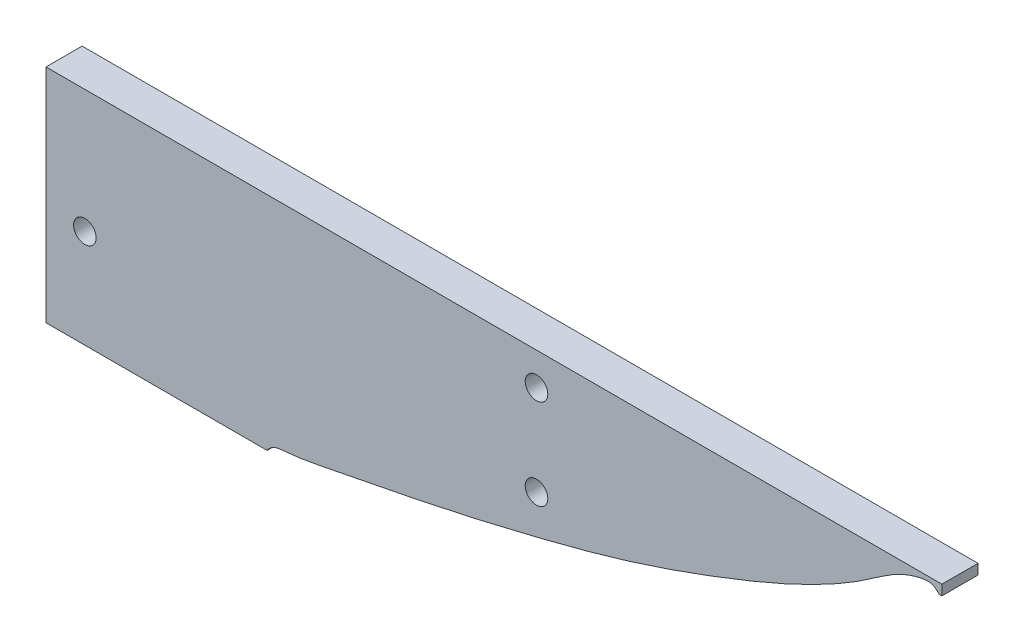
ISO-10303-21;
HEADER;
FILE_DESCRIPTION(('STEP AP214'),'2;1');
FILE_NAME('part.step','',(''),(''),'','','');
FILE_SCHEMA(('AUTOMOTIVE_DESIGN { 1 0 10303 214 1 1 1 1 }'));
ENDSEC;
DATA;
#1=APPLICATION_CONTEXT('core data for automotive mechanical design processes');
#2=APPLICATION_PROTOCOL_DEFINITION('international standard','automotive_design',2000,#1);
#3=PRODUCT_CONTEXT('',#1,'mechanical');
#4=PRODUCT('Part','Part','',(#3));
#5=PRODUCT_RELATED_PRODUCT_CATEGORY('part','',(#4));
#6=PRODUCT_DEFINITION_FORMATION('','',#4);
#7=PRODUCT_DEFINITION_CONTEXT('part definition',#1,'design');
#8=PRODUCT_DEFINITION('design','',#6,#7);
#9=PRODUCT_DEFINITION_SHAPE('','',#8);
#10=(LENGTH_UNIT() NAMED_UNIT(*) SI_UNIT(.MILLI.,.METRE.));
#11=(NAMED_UNIT(*) PLANE_ANGLE_UNIT() SI_UNIT($,.RADIAN.));
#12=(NAMED_UNIT(*) SI_UNIT($,.STERADIAN.) SOLID_ANGLE_UNIT());
#13=UNCERTAINTY_MEASURE_WITH_UNIT(LENGTH_MEASURE(1.E-05),#10,'distance_accuracy_value','');
#14=(GEOMETRIC_REPRESENTATION_CONTEXT(3) GLOBAL_UNCERTAINTY_ASSIGNED_CONTEXT((#13)) GLOBAL_UNIT_ASSIGNED_CONTEXT((#10,
#11,#12)) REPRESENTATION_CONTEXT('',''));
#15=CARTESIAN_POINT('',(0.,0.,0.));
#16=DIRECTION('',(0.,0.,1.));
#17=DIRECTION('',(1.,0.,0.));
#18=AXIS2_PLACEMENT_3D('',#15,#16,#17);
#19=CARTESIAN_POINT('',(17.2333887189385,-29.0220472319426,276.));
#20=DIRECTION('',(0.,0.,-1.));
#21=DIRECTION('',(-1.,0.,0.));
#22=AXIS2_PLACEMENT_3D('',#19,#20,#21);
#23=PLANE('',#22);
#24=CARTESIAN_POINT('',(0.0705666698621599,-25.,276.));
#25=DIRECTION('',(0.,0.,-1.));
#26=DIRECTION('',(-1.,0.,0.));
#27=AXIS2_PLACEMENT_3D('',#24,#25,#26);
#28=CIRCLE('',#27,2.5);
#29=CARTESIAN_POINT('',(-2.42943333013784,-25.,276.));
#30=VERTEX_POINT('',#29);
#31=EDGE_CURVE('E238',#30,#30,#28,.F.);
#32=ORIENTED_EDGE('',*,*,#31,.F.);
#33=EDGE_LOOP('',(#32));
#34=FACE_BOUND('',#33,.T.);
#35=CARTESIAN_POINT('',(89.2269503586397,1.49247205306208E-13,276.));
#36=CARTESIAN_POINT('',(89.1908642631752,0.0998298809493926,276.));
#37=CARTESIAN_POINT('',(89.12473322516,0.183706206110191,276.));
#38=CARTESIAN_POINT('',(88.9729048679818,0.329810453575534,276.));
#39=CARTESIAN_POINT('',(88.8904896104568,0.394857408906376,276.));
#40=CARTESIAN_POINT('',(88.644167156488,0.591135212475435,276.));
#41=CARTESIAN_POINT('',(88.4839696875495,0.727365268226304,276.));
#42=CARTESIAN_POINT('',(88.1379026837907,0.966441642701985,276.));
#43=CARTESIAN_POINT('',(87.956054395125,1.06793941582744,276.));
#44=CARTESIAN_POINT('',(87.658282860914,1.16902271226711,276.));
#45=CARTESIAN_POINT('',(87.555207302582,1.19535812571003,276.));
#46=CARTESIAN_POINT('',(87.3496293461408,1.23459941595705,276.));
#47=CARTESIAN_POINT('',(87.246249801161,1.24787231132341,276.));
#48=CARTESIAN_POINT('',(86.9348402087448,1.27403001856005,276.));
#49=CARTESIAN_POINT('',(86.7248702440939,1.27379048273107,276.));
#50=CARTESIAN_POINT('',(86.306423964309,1.25383675225267,276.));
#51=CARTESIAN_POINT('',(86.0990286290816,1.23505774639025,276.));
#52=CARTESIAN_POINT('',(85.4813808157867,1.15686620116418,276.));
#53=CARTESIAN_POINT('',(85.0758686909006,1.07462559045073,276.));
#54=CARTESIAN_POINT('',(83.8682590875084,0.784915195307387,276.));
#55=CARTESIAN_POINT('',(83.0711615958042,0.531094150862169,276.));
#56=CARTESIAN_POINT('',(81.5259256374172,-0.0576238139626139,276.));
#57=CARTESIAN_POINT('',(80.7765608345635,-0.394881318596581,276.));
#58=CARTESIAN_POINT('',(78.5965167383571,-1.53219615816202,276.));
#59=CARTESIAN_POINT('',(77.230754733304,-2.45201587282181,276.));
#60=CARTESIAN_POINT('',(75.1985385920178,-3.8620504783442,276.));
#61=CARTESIAN_POINT('',(74.5234682022098,-4.33617494178902,276.));
#62=CARTESIAN_POINT('',(73.1640950831805,-5.2684711868607,276.));
#63=CARTESIAN_POINT('',(72.4808892046777,-5.72857497254762,276.));
#64=CARTESIAN_POINT('',(70.4116337529203,-7.07515890200524,276.));
#65=CARTESIAN_POINT('',(69.0048975681431,-7.92611034015839,276.));
#66=CARTESIAN_POINT('',(66.1532783390216,-9.56249699877378,276.));
#67=CARTESIAN_POINT('',(64.708881598737,-10.3487674335368,276.));
#68=CARTESIAN_POINT('',(61.7933797544643,-11.875437398081,276.));
#69=CARTESIAN_POINT('',(60.3218826662428,-12.6151919015329,276.));
#70=CARTESIAN_POINT('',(57.3506439169798,-14.0460786107289,276.));
#71=CARTESIAN_POINT('',(55.8539001840211,-14.7366881290595,276.));
#72=CARTESIAN_POINT('',(51.337831470486,-16.7508374373275,276.));
#73=CARTESIAN_POINT('',(48.293308669808,-18.0196731609298,276.));
#74=CARTESIAN_POINT('',(42.1715920248814,-20.4657175408574,276.));
#75=CARTESIAN_POINT('',(39.0925038548523,-21.6413273019962,276.));
#76=CARTESIAN_POINT('',(32.9034762833672,-23.9123085332553,276.));
#77=CARTESIAN_POINT('',(29.7933959316709,-25.0086572761028,276.));
#78=CARTESIAN_POINT('',(23.5398431349112,-27.0984871184917,276.));
#79=CARTESIAN_POINT('',(20.3942529700696,-28.0888434338914,276.));
#80=CARTESIAN_POINT('',(14.0725244678072,-29.9552510299939,276.));
#81=CARTESIAN_POINT('',(10.8957614292863,-30.8321493890972,276.));
#82=CARTESIAN_POINT('',(4.52178111769644,-32.5135075856523,276.));
#83=CARTESIAN_POINT('',(1.32540922267386,-33.3212862958322,276.));
#84=CARTESIAN_POINT('',(-5.07614417074092,-34.8964917932046,276.));
#85=CARTESIAN_POINT('',(-8.2821060243183,-35.6624978049024,276.));
#86=CARTESIAN_POINT('',(-14.7061552609168,-37.1440056918165,276.));
#87=CARTESIAN_POINT('',(-17.9248976926897,-37.856829007306,276.));
#88=CARTESIAN_POINT('',(-24.3728549588553,-39.2319683362701,276.));
#89=CARTESIAN_POINT('',(-27.6019921231389,-39.8956389105145,276.));
#90=CARTESIAN_POINT('',(-34.0663458917021,-41.1922011265147,276.));
#91=CARTESIAN_POINT('',(-37.3005391050708,-41.8304024146382,276.));
#92=CARTESIAN_POINT('',(-42.1530043629878,-42.7816576800251,276.));
#93=CARTESIAN_POINT('',(-43.7705550169791,-43.0984582724244,276.));
#94=CARTESIAN_POINT('',(-46.1983652521204,-43.5659278854451,276.));
#95=CARTESIAN_POINT('',(-47.0078976626582,-43.720382588257,276.));
#96=CARTESIAN_POINT('',(-48.6273609163055,-44.0272135007652,276.));
#97=CARTESIAN_POINT('',(-49.4369227355959,-44.1817696551541,276.));
#98=CARTESIAN_POINT('',(-51.0584401473537,-44.476432935129,276.));
#99=CARTESIAN_POINT('',(-51.8708424327574,-44.6139088288052,276.));
#100=CARTESIAN_POINT('',(-53.0956767619379,-44.7827589887938,276.));
#101=CARTESIAN_POINT('',(-53.5049562500999,-44.8330512012459,276.));
#102=CARTESIAN_POINT('',(-54.325702170619,-44.9204211703346,276.));
#103=CARTESIAN_POINT('',(-54.7375224891055,-44.9553679185136,276.));
#104=CARTESIAN_POINT('',(-55.5621587457519,-45.0192504910567,276.));
#105=CARTESIAN_POINT('',(-55.9744736564472,-45.0512112033362,276.));
#106=CARTESIAN_POINT('',(-56.7930669092068,-45.1515776230256,276.));
#107=CARTESIAN_POINT('',(-57.2000247263942,-45.215881088075,276.));
#108=CARTESIAN_POINT('',(-57.7982740111188,-45.385916370147,276.));
#109=CARTESIAN_POINT('',(-57.995561765395,-45.455446388705,276.));
#110=CARTESIAN_POINT('',(-58.2860399847313,-45.5926656801053,276.));
#111=CARTESIAN_POINT('',(-58.3828971858376,-45.6445846347909,276.));
#112=CARTESIAN_POINT('',(-58.5682150358491,-45.7590157817693,276.));
#113=CARTESIAN_POINT('',(-58.6569406203326,-45.8212423557429,276.));
#114=CARTESIAN_POINT('',(-58.9154178364917,-46.0177311406933,276.));
#115=CARTESIAN_POINT('',(-59.0752702518724,-46.164604763616,276.));
#116=CARTESIAN_POINT('',(-59.3117627427097,-46.3891016675219,276.));
#117=CARTESIAN_POINT('',(-59.3894997364969,-46.4650349885878,276.));
#118=CARTESIAN_POINT('',(-59.5289937891365,-46.6317604617944,276.));
#119=CARTESIAN_POINT('',(-59.5889433789973,-46.7262640546928,276.));
#120=CARTESIAN_POINT('',(-59.6152711669954,-46.8312276483597,276.));
#121=B_SPLINE_CURVE_WITH_KNOTS('',3,(#35,#36,#37,#38,#39,#40,#41,#42,#43,#44,#45,#46,#47,#48,
#49,#50,#51,#52,#53,#54,#55,#56,#57,#58,#59,#60,#61,#62,#63,#64,#65,#66,#67,#68,#69,#70,#71,#72,
#73,#74,#75,#76,#77,#78,#79,#80,#81,#82,#83,#84,#85,#86,#87,#88,#89,#90,#91,#92,#93,#94,#95,#96,
#97,#98,#99,#100,#101,#102,#103,#104,#105,#106,#107,#108,#109,#110,#111,#112,#113,#114,#115,
#116,#117,#118,#119,#120),.UNSPECIFIED.,.F.,.F.,(4,2,2,2,2,2,2,2,2,2,2,2,2,2,2,2,2,2,2,2,2,2,2,
2,2,2,2,2,2,2,2,2,2,2,2,2,2,2,2,2,2,2,4),(0.,0.00195312500000033,0.00390625000000067,
0.00781250000000122,0.0117187500000017,0.0136718750000018,0.0156250000000019,0.0195312500000019,
0.0234375000000019,0.0312500000000019,0.0468750000000016,0.0625000000000012,0.0937500000000008,
0.109375000000001,0.125000000000001,0.156250000000001,0.187500000000001,0.218750000000001,
0.250000000000001,0.312500000000001,0.375000000000001,0.4375,0.5,0.5625,0.625,0.6875,0.75,
0.8125,0.875,0.90625,0.921875,0.9375,0.953125,0.9609375,0.96875,0.9765625,0.984375,0.98828125,
0.990234375,0.9921875,0.99609375,0.998046875,1.),.UNSPECIFIED.);
#122=CARTESIAN_POINT('',(-59.6152711669953,-46.8312276483596,276.));
#123=VERTEX_POINT('',#122);
#124=CARTESIAN_POINT('',(89.2269503586398,0.,276.));
#125=VERTEX_POINT('',#124);
#126=EDGE_CURVE('E196',#123,#125,#121,.F.);
#127=ORIENTED_EDGE('',*,*,#126,.T.);
#128=DIRECTION('',(1.,0.,0.));
#129=VECTOR('',#128,1.);
#130=CARTESIAN_POINT('',(89.2269503586398,0.,276.));
#131=LINE('',#130,#129);
#132=CARTESIAN_POINT('',(89.8916366130668,0.,276.));
#133=VERTEX_POINT('',#132);
#134=EDGE_CURVE('E90',#125,#133,#131,.T.);
#135=ORIENTED_EDGE('',*,*,#134,.T.);
#136=DIRECTION('',(0.,1.,0.));
#137=VECTOR('',#136,1.);
#138=CARTESIAN_POINT('',(89.8916366130668,2.25600000000004,276.));
#139=LINE('',#138,#137);
#140=CARTESIAN_POINT('',(89.8916366130668,2.25600000000004,276.));
#141=VERTEX_POINT('',#140);
#142=EDGE_CURVE('E103',#133,#141,#139,.T.);
#143=ORIENTED_EDGE('',*,*,#142,.T.);
#144=DIRECTION('',(-1.,0.,0.));
#145=VECTOR('',#144,1.);
#146=CARTESIAN_POINT('',(89.8916366130668,2.25600000000004,276.));
#147=LINE('',#146,#145);
#148=CARTESIAN_POINT('',(-108.607261007694,2.25600000000002,276.));
#149=VERTEX_POINT('',#148);
#150=EDGE_CURVE('E97',#141,#149,#147,.T.);
#151=ORIENTED_EDGE('',*,*,#150,.T.);
#152=DIRECTION('',(0.,-1.,0.));
#153=VECTOR('',#152,1.);
#154=CARTESIAN_POINT('',(-108.607261007694,-46.8398070824682,276.));
#155=LINE('',#154,#153);
#156=CARTESIAN_POINT('',(-108.607261007694,-46.8398070824682,276.));
#157=VERTEX_POINT('',#156);
#158=EDGE_CURVE('E101',#149,#157,#155,.T.);
#159=ORIENTED_EDGE('',*,*,#158,.T.);
#160=CARTESIAN_POINT('',(-59.6152711669953,-46.8312276483596,276.));
#161=CARTESIAN_POINT('',(-75.9459341047568,-46.8356281130031,276.));
#162=CARTESIAN_POINT('',(-92.276597535054,-46.8384307623825,276.));
#163=CARTESIAN_POINT('',(-108.607261007694,-46.8398070824681,276.));
#164=B_SPLINE_CURVE_WITH_KNOTS('',3,(#160,#161,#162,#163),.UNSPECIFIED.,.F.,.F.,(4,4),(0.,1.),.UNSPECIFIED.);
#165=EDGE_CURVE('E51',#157,#123,#164,.F.);
#166=ORIENTED_EDGE('',*,*,#165,.T.);
#167=EDGE_LOOP('',(#127,#135,#143,#151,#159,#166));
#168=FACE_BOUND('',#167,.T.);
#169=CARTESIAN_POINT('',(0.0705666698621599,-4.96037406111782,276.));
#170=DIRECTION('',(0.,0.,-1.));
#171=DIRECTION('',(-1.,0.,0.));
#172=AXIS2_PLACEMENT_3D('',#169,#170,#171);
#173=CIRCLE('',#172,2.5);
#174=CARTESIAN_POINT('',(-2.42943333013784,-4.96037406111782,276.));
#175=VERTEX_POINT('',#174);
#176=EDGE_CURVE('E237',#175,#175,#173,.F.);
#177=ORIENTED_EDGE('',*,*,#176,.F.);
#178=EDGE_LOOP('',(#177));
#179=FACE_BOUND('',#178,.T.);
#180=CARTESIAN_POINT('',(-100.,-25.,276.));
#181=DIRECTION('',(0.,0.,-1.));
#182=DIRECTION('',(-1.,0.,0.));
#183=AXIS2_PLACEMENT_3D('',#180,#181,#182);
#184=CIRCLE('',#183,2.5);
#185=CARTESIAN_POINT('',(-102.5,-25.,276.));
#186=VERTEX_POINT('',#185);
#187=EDGE_CURVE('E241',#186,#186,#184,.F.);
#188=ORIENTED_EDGE('',*,*,#187,.F.);
#189=EDGE_LOOP('',(#188));
#190=FACE_BOUND('',#189,.T.);
#191=ADVANCED_FACE('F30',(#34,#168,#179,#190),#23,.F.);
#192=CARTESIAN_POINT('',(17.2333887189385,-29.0220472319426,268.));
#193=DIRECTION('',(0.,0.,-1.));
#194=DIRECTION('',(-1.,0.,0.));
#195=AXIS2_PLACEMENT_3D('',#192,#193,#194);
#196=PLANE('',#195);
#197=CARTESIAN_POINT('',(0.0705666698621599,-25.,268.));
#198=DIRECTION('',(0.,0.,-1.));
#199=DIRECTION('',(-1.,0.,0.));
#200=AXIS2_PLACEMENT_3D('',#197,#198,#199);
#201=CIRCLE('',#200,2.5);
#202=CARTESIAN_POINT('',(-2.42943333013784,-25.,268.));
#203=VERTEX_POINT('',#202);
#204=EDGE_CURVE('E239',#203,#203,#201,.F.);
#205=ORIENTED_EDGE('',*,*,#204,.T.);
#206=EDGE_LOOP('',(#205));
#207=FACE_BOUND('',#206,.T.);
#208=CARTESIAN_POINT('',(-59.6152711669954,-46.8312276483597,268.));
#209=CARTESIAN_POINT('',(-59.5889433789973,-46.7262640546928,268.));
#210=CARTESIAN_POINT('',(-59.5289937891365,-46.6317604617944,268.));
#211=CARTESIAN_POINT('',(-59.3894997364969,-46.4650349885878,268.));
#212=CARTESIAN_POINT('',(-59.3117627427097,-46.3891016675219,268.));
#213=CARTESIAN_POINT('',(-59.0752702518724,-46.164604763616,268.));
#214=CARTESIAN_POINT('',(-58.9154178364917,-46.0177311406933,268.));
#215=CARTESIAN_POINT('',(-58.6569406203326,-45.8212423557429,268.));
#216=CARTESIAN_POINT('',(-58.5682150358491,-45.7590157817693,268.));
#217=CARTESIAN_POINT('',(-58.3828971858376,-45.6445846347909,268.));
#218=CARTESIAN_POINT('',(-58.2860399847313,-45.5926656801053,268.));
#219=CARTESIAN_POINT('',(-57.995561765395,-45.455446388705,268.));
#220=CARTESIAN_POINT('',(-57.7982740111188,-45.385916370147,268.));
#221=CARTESIAN_POINT('',(-57.2000247263942,-45.215881088075,268.));
#222=CARTESIAN_POINT('',(-56.7930669092068,-45.1515776230256,268.));
#223=CARTESIAN_POINT('',(-55.9744736564472,-45.0512112033362,268.));
#224=CARTESIAN_POINT('',(-55.5621587457519,-45.0192504910567,268.));
#225=CARTESIAN_POINT('',(-54.7375224891055,-44.9553679185136,268.));
#226=CARTESIAN_POINT('',(-54.325702170619,-44.9204211703346,268.));
#227=CARTESIAN_POINT('',(-53.5049562500999,-44.8330512012459,268.));
#228=CARTESIAN_POINT('',(-53.0956767619379,-44.7827589887938,268.));
#229=CARTESIAN_POINT('',(-51.8708424327574,-44.6139088288052,268.));
#230=CARTESIAN_POINT('',(-51.0584401473537,-44.476432935129,268.));
#231=CARTESIAN_POINT('',(-49.4369227355959,-44.1817696551541,268.));
#232=CARTESIAN_POINT('',(-48.6273609163055,-44.0272135007652,268.));
#233=CARTESIAN_POINT('',(-47.0078976626582,-43.720382588257,268.));
#234=CARTESIAN_POINT('',(-46.1983652521204,-43.5659278854451,268.));
#235=CARTESIAN_POINT('',(-43.7705550169791,-43.0984582724244,268.));
#236=CARTESIAN_POINT('',(-42.1530043629878,-42.7816576800251,268.));
#237=CARTESIAN_POINT('',(-37.3005391050708,-41.8304024146382,268.));
#238=CARTESIAN_POINT('',(-34.0663458917021,-41.1922011265147,268.));
#239=CARTESIAN_POINT('',(-27.6019921231389,-39.8956389105145,268.));
#240=CARTESIAN_POINT('',(-24.3728549588553,-39.2319683362701,268.));
#241=CARTESIAN_POINT('',(-17.9248976926897,-37.856829007306,268.));
#242=CARTESIAN_POINT('',(-14.7061552609168,-37.1440056918165,268.));
#243=CARTESIAN_POINT('',(-8.2821060243183,-35.6624978049024,268.));
#244=CARTESIAN_POINT('',(-5.07614417074092,-34.8964917932046,268.));
#245=CARTESIAN_POINT('',(1.32540922267386,-33.3212862958322,268.));
#246=CARTESIAN_POINT('',(4.52178111769644,-32.5135075856523,268.));
#247=CARTESIAN_POINT('',(10.8957614292863,-30.8321493890972,268.));
#248=CARTESIAN_POINT('',(14.0725244678072,-29.9552510299939,268.));
#249=CARTESIAN_POINT('',(20.3942529700696,-28.0888434338914,268.));
#250=CARTESIAN_POINT('',(23.5398431349112,-27.0984871184917,268.));
#251=CARTESIAN_POINT('',(29.7933959316709,-25.0086572761028,268.));
#252=CARTESIAN_POINT('',(32.9034762833672,-23.9123085332553,268.));
#253=CARTESIAN_POINT('',(39.0925038548523,-21.6413273019962,268.));
#254=CARTESIAN_POINT('',(42.1715920248814,-20.4657175408574,268.));
#255=CARTESIAN_POINT('',(48.293308669808,-18.0196731609298,268.));
#256=CARTESIAN_POINT('',(51.337831470486,-16.7508374373275,268.));
#257=CARTESIAN_POINT('',(55.8539001840211,-14.7366881290595,268.));
#258=CARTESIAN_POINT('',(57.3506439169798,-14.0460786107289,268.));
#259=CARTESIAN_POINT('',(60.3218826662428,-12.6151919015329,268.));
#260=CARTESIAN_POINT('',(61.7933797544643,-11.875437398081,268.));
#261=CARTESIAN_POINT('',(64.708881598737,-10.3487674335368,268.));
#262=CARTESIAN_POINT('',(66.1532783390216,-9.56249699877378,268.));
#263=CARTESIAN_POINT('',(69.0048975681431,-7.92611034015839,268.));
#264=CARTESIAN_POINT('',(70.4116337529203,-7.07515890200524,268.));
#265=CARTESIAN_POINT('',(72.4808892046777,-5.72857497254762,268.));
#266=CARTESIAN_POINT('',(73.1640950831805,-5.2684711868607,268.));
#267=CARTESIAN_POINT('',(74.5234682022098,-4.33617494178902,268.));
#268=CARTESIAN_POINT('',(75.1985385920178,-3.8620504783442,268.));
#269=CARTESIAN_POINT('',(77.230754733304,-2.45201587282181,268.));
#270=CARTESIAN_POINT('',(78.5965167383571,-1.53219615816202,268.));
#271=CARTESIAN_POINT('',(80.7765608345635,-0.394881318596581,268.));
#272=CARTESIAN_POINT('',(81.5259256374172,-0.0576238139626139,268.));
#273=CARTESIAN_POINT('',(83.0711615958042,0.531094150862169,268.));
#274=CARTESIAN_POINT('',(83.8682590875084,0.784915195307387,268.));
#275=CARTESIAN_POINT('',(85.0758686909006,1.07462559045073,268.));
#276=CARTESIAN_POINT('',(85.4813808157867,1.15686620116418,268.));
#277=CARTESIAN_POINT('',(86.0990286290816,1.23505774639025,268.));
#278=CARTESIAN_POINT('',(86.306423964309,1.25383675225267,268.));
#279=CARTESIAN_POINT('',(86.7248702440939,1.27379048273107,268.));
#280=CARTESIAN_POINT('',(86.9348402087448,1.27403001856005,268.));
#281=CARTESIAN_POINT('',(87.246249801161,1.24787231132341,268.));
#282=CARTESIAN_POINT('',(87.3496293461408,1.23459941595705,268.));
#283=CARTESIAN_POINT('',(87.555207302582,1.19535812571003,268.));
#284=CARTESIAN_POINT('',(87.658282860914,1.16902271226711,268.));
#285=CARTESIAN_POINT('',(87.956054395125,1.06793941582744,268.));
#286=CARTESIAN_POINT('',(88.1379026837907,0.966441642701985,268.));
#287=CARTESIAN_POINT('',(88.4839696875495,0.727365268226304,268.));
#288=CARTESIAN_POINT('',(88.644167156488,0.591135212475435,268.));
#289=CARTESIAN_POINT('',(88.8904896104568,0.394857408906376,268.));
#290=CARTESIAN_POINT('',(88.9729048679818,0.329810453575534,268.));
#291=CARTESIAN_POINT('',(89.12473322516,0.183706206110191,268.));
#292=CARTESIAN_POINT('',(89.1908642631752,0.0998298809493926,268.));
#293=CARTESIAN_POINT('',(89.2269503586397,1.49247205306208E-13,268.));
#294=B_SPLINE_CURVE_WITH_KNOTS('',3,(#208,#209,#210,#211,#212,#213,#214,#215,#216,#217,#218,
#219,#220,#221,#222,#223,#224,#225,#226,#227,#228,#229,#230,#231,#232,#233,#234,#235,#236,#237,
#238,#239,#240,#241,#242,#243,#244,#245,#246,#247,#248,#249,#250,#251,#252,#253,#254,#255,#256,
#257,#258,#259,#260,#261,#262,#263,#264,#265,#266,#267,#268,#269,#270,#271,#272,#273,#274,#275,
#276,#277,#278,#279,#280,#281,#282,#283,#284,#285,#286,#287,#288,#289,#290,#291,#292,#293),
.UNSPECIFIED.,.F.,.F.,(4,2,2,2,2,2,2,2,2,2,2,2,2,2,2,2,2,2,2,2,2,2,2,2,2,2,2,2,2,2,2,2,2,2,2,2,
2,2,2,2,2,2,4),(0.,0.00195312499999989,0.00390624999999978,0.00781249999999967,
0.00976562499999978,0.0117187499999998,0.0156249999999998,0.0234374999999998,0.0312499999999999,
0.0390624999999999,0.046875,0.0624999999999999,0.0781249999999999,0.0937499999999999,0.125,
0.1875,0.25,0.3125,0.375,0.4375,0.5,0.5625,0.624999999999999,0.687499999999999,
0.749999999999999,0.781249999999999,0.812499999999999,0.843749999999999,0.874999999999999,
0.890624999999999,0.906249999999999,0.937499999999999,0.953124999999998,0.968749999999998,
0.976562499999998,0.980468749999998,0.984374999999998,0.986328124999998,0.988281249999998,
0.992187499999999,0.996093749999999,0.998046875,1.),.UNSPECIFIED.);
#295=CARTESIAN_POINT('',(-59.6152711669953,-46.8312276483596,268.));
#296=VERTEX_POINT('',#295);
#297=CARTESIAN_POINT('',(89.2269503586398,0.,268.));
#298=VERTEX_POINT('',#297);
#299=EDGE_CURVE('E213',#296,#298,#294,.T.);
#300=ORIENTED_EDGE('',*,*,#299,.F.);
#301=CARTESIAN_POINT('',(-108.607261007694,-46.8398070824681,268.));
#302=CARTESIAN_POINT('',(-92.276597535054,-46.8384307623825,268.));
#303=CARTESIAN_POINT('',(-75.9459341047568,-46.8356281130031,268.));
#304=CARTESIAN_POINT('',(-59.6152711669953,-46.8312276483596,268.));
#305=B_SPLINE_CURVE_WITH_KNOTS('',3,(#301,#302,#303,#304),.UNSPECIFIED.,.F.,.F.,(4,4),(0.,1.),.UNSPECIFIED.);
#306=CARTESIAN_POINT('',(-108.607261007694,-46.8398070824682,268.));
#307=VERTEX_POINT('',#306);
#308=EDGE_CURVE('E81',#307,#296,#305,.T.);
#309=ORIENTED_EDGE('',*,*,#308,.F.);
#310=DIRECTION('',(0.,-1.,0.));
#311=VECTOR('',#310,1.);
#312=CARTESIAN_POINT('',(-108.607261007694,-46.8398070824682,268.));
#313=LINE('',#312,#311);
#314=CARTESIAN_POINT('',(-108.607261007694,2.25600000000002,268.));
#315=VERTEX_POINT('',#314);
#316=EDGE_CURVE('E75',#315,#307,#313,.T.);
#317=ORIENTED_EDGE('',*,*,#316,.F.);
#318=DIRECTION('',(-1.,0.,0.));
#319=VECTOR('',#318,1.);
#320=CARTESIAN_POINT('',(89.8916366130668,2.25600000000004,268.));
#321=LINE('',#320,#319);
#322=CARTESIAN_POINT('',(89.8916366130668,2.25600000000004,268.));
#323=VERTEX_POINT('',#322);
#324=EDGE_CURVE('E111',#323,#315,#321,.T.);
#325=ORIENTED_EDGE('',*,*,#324,.F.);
#326=DIRECTION('',(0.,1.,0.));
#327=VECTOR('',#326,1.);
#328=CARTESIAN_POINT('',(89.8916366130668,2.25600000000004,268.));
#329=LINE('',#328,#327);
#330=CARTESIAN_POINT('',(89.8916366130668,0.,268.));
#331=VERTEX_POINT('',#330);
#332=EDGE_CURVE('E158',#331,#323,#329,.T.);
#333=ORIENTED_EDGE('',*,*,#332,.F.);
#334=DIRECTION('',(1.,0.,0.));
#335=VECTOR('',#334,1.);
#336=CARTESIAN_POINT('',(89.2269503586398,0.,268.));
#337=LINE('',#336,#335);
#338=EDGE_CURVE('E163',#298,#331,#337,.T.);
#339=ORIENTED_EDGE('',*,*,#338,.F.);
#340=EDGE_LOOP('',(#300,#309,#317,#325,#333,#339));
#341=FACE_BOUND('',#340,.T.);
#342=CARTESIAN_POINT('',(0.0705666698621599,-4.96037406111782,268.));
#343=DIRECTION('',(0.,0.,-1.));
#344=DIRECTION('',(-1.,0.,0.));
#345=AXIS2_PLACEMENT_3D('',#342,#343,#344);
#346=CIRCLE('',#345,2.5);
#347=CARTESIAN_POINT('',(-2.42943333013784,-4.96037406111782,268.));
#348=VERTEX_POINT('',#347);
#349=EDGE_CURVE('E235',#348,#348,#346,.F.);
#350=ORIENTED_EDGE('',*,*,#349,.T.);
#351=EDGE_LOOP('',(#350));
#352=FACE_BOUND('',#351,.T.);
#353=CARTESIAN_POINT('',(-100.,-25.,268.));
#354=DIRECTION('',(0.,0.,-1.));
#355=DIRECTION('',(-1.,0.,0.));
#356=AXIS2_PLACEMENT_3D('',#353,#354,#355);
#357=CIRCLE('',#356,2.5);
#358=CARTESIAN_POINT('',(-102.5,-25.,268.));
#359=VERTEX_POINT('',#358);
#360=EDGE_CURVE('E36',#359,#359,#357,.F.);
#361=ORIENTED_EDGE('',*,*,#360,.T.);
#362=EDGE_LOOP('',(#361));
#363=FACE_BOUND('',#362,.T.);
#364=ADVANCED_FACE('F148',(#207,#341,#352,#363),#196,.T.);
#365=CARTESIAN_POINT('',(-59.6152711669954,-46.8312276483597,276.));
#366=CARTESIAN_POINT('',(-59.5889433789973,-46.7262640546928,276.));
#367=CARTESIAN_POINT('',(-59.5289937891365,-46.6317604617944,276.));
#368=CARTESIAN_POINT('',(-59.3894997364969,-46.4650349885878,276.));
#369=CARTESIAN_POINT('',(-59.3117627427097,-46.3891016675219,276.));
#370=CARTESIAN_POINT('',(-59.0752702518724,-46.164604763616,276.));
#371=CARTESIAN_POINT('',(-58.9154178364917,-46.0177311406933,276.));
#372=CARTESIAN_POINT('',(-58.6569406203326,-45.8212423557429,276.));
#373=CARTESIAN_POINT('',(-58.5682150358491,-45.7590157817693,276.));
#374=CARTESIAN_POINT('',(-58.3828971858376,-45.6445846347909,276.));
#375=CARTESIAN_POINT('',(-58.2860399847313,-45.5926656801053,276.));
#376=CARTESIAN_POINT('',(-57.995561765395,-45.455446388705,276.));
#377=CARTESIAN_POINT('',(-57.7982740111188,-45.385916370147,276.));
#378=CARTESIAN_POINT('',(-57.2000247263942,-45.215881088075,276.));
#379=CARTESIAN_POINT('',(-56.7930669092068,-45.1515776230256,276.));
#380=CARTESIAN_POINT('',(-55.9744736564472,-45.0512112033362,276.));
#381=CARTESIAN_POINT('',(-55.5621587457519,-45.0192504910567,276.));
#382=CARTESIAN_POINT('',(-54.7375224891055,-44.9553679185136,276.));
#383=CARTESIAN_POINT('',(-54.325702170619,-44.9204211703346,276.));
#384=CARTESIAN_POINT('',(-53.5049562500999,-44.8330512012459,276.));
#385=CARTESIAN_POINT('',(-53.0956767619379,-44.7827589887938,276.));
#386=CARTESIAN_POINT('',(-51.8708424327574,-44.6139088288052,276.));
#387=CARTESIAN_POINT('',(-51.0584401473537,-44.476432935129,276.));
#388=CARTESIAN_POINT('',(-49.4369227355959,-44.1817696551541,276.));
#389=CARTESIAN_POINT('',(-48.6273609163055,-44.0272135007652,276.));
#390=CARTESIAN_POINT('',(-47.0078976626582,-43.720382588257,276.));
#391=CARTESIAN_POINT('',(-46.1983652521204,-43.5659278854451,276.));
#392=CARTESIAN_POINT('',(-43.7705550169791,-43.0984582724244,276.));
#393=CARTESIAN_POINT('',(-42.1530043629878,-42.7816576800251,276.));
#394=CARTESIAN_POINT('',(-37.3005391050708,-41.8304024146382,276.));
#395=CARTESIAN_POINT('',(-34.0663458917021,-41.1922011265147,276.));
#396=CARTESIAN_POINT('',(-27.6019921231389,-39.8956389105145,276.));
#397=CARTESIAN_POINT('',(-24.3728549588553,-39.2319683362701,276.));
#398=CARTESIAN_POINT('',(-17.9248976926897,-37.856829007306,276.));
#399=CARTESIAN_POINT('',(-14.7061552609168,-37.1440056918165,276.));
#400=CARTESIAN_POINT('',(-8.2821060243183,-35.6624978049024,276.));
#401=CARTESIAN_POINT('',(-5.07614417074092,-34.8964917932046,276.));
#402=CARTESIAN_POINT('',(1.32540922267386,-33.3212862958322,276.));
#403=CARTESIAN_POINT('',(4.52178111769644,-32.5135075856523,276.));
#404=CARTESIAN_POINT('',(10.8957614292863,-30.8321493890972,276.));
#405=CARTESIAN_POINT('',(14.0725244678072,-29.9552510299939,276.));
#406=CARTESIAN_POINT('',(20.3942529700696,-28.0888434338914,276.));
#407=CARTESIAN_POINT('',(23.5398431349112,-27.0984871184917,276.));
#408=CARTESIAN_POINT('',(29.7933959316709,-25.0086572761028,276.));
#409=CARTESIAN_POINT('',(32.9034762833672,-23.9123085332553,276.));
#410=CARTESIAN_POINT('',(39.0925038548523,-21.6413273019962,276.));
#411=CARTESIAN_POINT('',(42.1715920248814,-20.4657175408574,276.));
#412=CARTESIAN_POINT('',(48.293308669808,-18.0196731609298,276.));
#413=CARTESIAN_POINT('',(51.337831470486,-16.7508374373275,276.));
#414=CARTESIAN_POINT('',(55.8539001840211,-14.7366881290595,276.));
#415=CARTESIAN_POINT('',(57.3506439169798,-14.0460786107289,276.));
#416=CARTESIAN_POINT('',(60.3218826662428,-12.6151919015329,276.));
#417=CARTESIAN_POINT('',(61.7933797544643,-11.875437398081,276.));
#418=CARTESIAN_POINT('',(64.708881598737,-10.3487674335368,276.));
#419=CARTESIAN_POINT('',(66.1532783390216,-9.56249699877378,276.));
#420=CARTESIAN_POINT('',(69.0048975681431,-7.92611034015839,276.));
#421=CARTESIAN_POINT('',(70.4116337529203,-7.07515890200524,276.));
#422=CARTESIAN_POINT('',(72.4808892046777,-5.72857497254762,276.));
#423=CARTESIAN_POINT('',(73.1640950831805,-5.2684711868607,276.));
#424=CARTESIAN_POINT('',(74.5234682022098,-4.33617494178902,276.));
#425=CARTESIAN_POINT('',(75.1985385920178,-3.8620504783442,276.));
#426=CARTESIAN_POINT('',(77.230754733304,-2.45201587282181,276.));
#427=CARTESIAN_POINT('',(78.5965167383571,-1.53219615816202,276.));
#428=CARTESIAN_POINT('',(80.7765608345635,-0.394881318596581,276.));
#429=CARTESIAN_POINT('',(81.5259256374172,-0.0576238139626139,276.));
#430=CARTESIAN_POINT('',(83.0711615958042,0.531094150862169,276.));
#431=CARTESIAN_POINT('',(83.8682590875084,0.784915195307387,276.));
#432=CARTESIAN_POINT('',(85.0758686909006,1.07462559045073,276.));
#433=CARTESIAN_POINT('',(85.4813808157867,1.15686620116418,276.));
#434=CARTESIAN_POINT('',(86.0990286290816,1.23505774639025,276.));
#435=CARTESIAN_POINT('',(86.306423964309,1.25383675225267,276.));
#436=CARTESIAN_POINT('',(86.7248702440939,1.27379048273107,276.));
#437=CARTESIAN_POINT('',(86.9348402087448,1.27403001856005,276.));
#438=CARTESIAN_POINT('',(87.246249801161,1.24787231132341,276.));
#439=CARTESIAN_POINT('',(87.3496293461408,1.23459941595705,276.));
#440=CARTESIAN_POINT('',(87.555207302582,1.19535812571003,276.));
#441=CARTESIAN_POINT('',(87.658282860914,1.16902271226711,276.));
#442=CARTESIAN_POINT('',(87.956054395125,1.06793941582744,276.));
#443=CARTESIAN_POINT('',(88.1379026837907,0.966441642701985,276.));
#444=CARTESIAN_POINT('',(88.4839696875495,0.727365268226304,276.));
#445=CARTESIAN_POINT('',(88.644167156488,0.591135212475435,276.));
#446=CARTESIAN_POINT('',(88.8904896104568,0.394857408906376,276.));
#447=CARTESIAN_POINT('',(88.9729048679818,0.329810453575534,276.));
#448=CARTESIAN_POINT('',(89.12473322516,0.183706206110191,276.));
#449=CARTESIAN_POINT('',(89.1908642631752,0.0998298809493926,276.));
#450=CARTESIAN_POINT('',(89.2269503586397,1.49247205306208E-13,276.));
#451=B_SPLINE_CURVE_WITH_KNOTS('',3,(#365,#366,#367,#368,#369,#370,#371,#372,#373,#374,#375,
#376,#377,#378,#379,#380,#381,#382,#383,#384,#385,#386,#387,#388,#389,#390,#391,#392,#393,#394,
#395,#396,#397,#398,#399,#400,#401,#402,#403,#404,#405,#406,#407,#408,#409,#410,#411,#412,#413,
#414,#415,#416,#417,#418,#419,#420,#421,#422,#423,#424,#425,#426,#427,#428,#429,#430,#431,#432,
#433,#434,#435,#436,#437,#438,#439,#440,#441,#442,#443,#444,#445,#446,#447,#448,#449,#450),
.UNSPECIFIED.,.F.,.F.,(4,2,2,2,2,2,2,2,2,2,2,2,2,2,2,2,2,2,2,2,2,2,2,2,2,2,2,2,2,2,2,2,2,2,2,2,
2,2,2,2,2,2,4),(0.,0.00195312499999989,0.00390624999999978,0.00781249999999967,
0.00976562499999978,0.0117187499999998,0.0156249999999998,0.0234374999999998,0.0312499999999999,
0.0390624999999999,0.046875,0.0624999999999999,0.0781249999999999,0.0937499999999999,0.125,
0.1875,0.25,0.3125,0.375,0.4375,0.5,0.5625,0.624999999999999,0.687499999999999,
0.749999999999999,0.781249999999999,0.812499999999999,0.843749999999999,0.874999999999999,
0.890624999999999,0.906249999999999,0.937499999999999,0.953124999999998,0.968749999999998,
0.976562499999998,0.980468749999998,0.984374999999998,0.986328124999998,0.988281249999998,
0.992187499999999,0.996093749999999,0.998046875,1.),.UNSPECIFIED.);
#452=DIRECTION('',(0.,0.,-1.));
#453=VECTOR('',#452,1.);
#454=SURFACE_OF_LINEAR_EXTRUSION('',#451,#453);
#455=ORIENTED_EDGE('',*,*,#299,.T.);
#456=DIRECTION('',(0.,0.,-1.));
#457=VECTOR('',#456,1.);
#458=CARTESIAN_POINT('',(89.2269503586398,0.,276.));
#459=LINE('',#458,#457);
#460=EDGE_CURVE('E11',#125,#298,#459,.T.);
#461=ORIENTED_EDGE('',*,*,#460,.F.);
#462=ORIENTED_EDGE('',*,*,#126,.F.);
#463=DIRECTION('',(0.,0.,-1.));
#464=VECTOR('',#463,1.);
#465=CARTESIAN_POINT('',(-59.6152711669953,-46.8312276483596,276.));
#466=LINE('',#465,#464);
#467=EDGE_CURVE('E117',#123,#296,#466,.T.);
#468=ORIENTED_EDGE('',*,*,#467,.T.);
#469=EDGE_LOOP('',(#455,#461,#462,#468));
#470=FACE_BOUND('',#469,.T.);
#471=ADVANCED_FACE('F32',(#470),#454,.F.);
#472=CARTESIAN_POINT('',(89.2269503586398,0.,276.));
#473=DIRECTION('',(0.,1.,0.));
#474=DIRECTION('',(-1.,0.,0.));
#475=AXIS2_PLACEMENT_3D('',#472,#473,#474);
#476=PLANE('',#475);
#477=ORIENTED_EDGE('',*,*,#338,.T.);
#478=DIRECTION('',(0.,0.,-1.));
#479=VECTOR('',#478,1.);
#480=CARTESIAN_POINT('',(89.8916366130668,0.,276.));
#481=LINE('',#480,#479);
#482=EDGE_CURVE('E42',#133,#331,#481,.T.);
#483=ORIENTED_EDGE('',*,*,#482,.F.);
#484=ORIENTED_EDGE('',*,*,#134,.F.);
#485=ORIENTED_EDGE('',*,*,#460,.T.);
#486=EDGE_LOOP('',(#477,#483,#484,#485));
#487=FACE_BOUND('',#486,.T.);
#488=ADVANCED_FACE('F322',(#487),#476,.F.);
#489=CARTESIAN_POINT('',(89.8916366130668,2.25600000000004,276.));
#490=DIRECTION('',(-1.,0.,0.));
#491=DIRECTION('',(0.,0.,1.));
#492=AXIS2_PLACEMENT_3D('',#489,#490,#491);
#493=PLANE('',#492);
#494=ORIENTED_EDGE('',*,*,#332,.T.);
#495=DIRECTION('',(0.,0.,-1.));
#496=VECTOR('',#495,1.);
#497=CARTESIAN_POINT('',(89.8916366130668,2.25600000000004,276.));
#498=LINE('',#497,#496);
#499=EDGE_CURVE('E112',#141,#323,#498,.T.);
#500=ORIENTED_EDGE('',*,*,#499,.F.);
#501=ORIENTED_EDGE('',*,*,#142,.F.);
#502=ORIENTED_EDGE('',*,*,#482,.T.);
#503=EDGE_LOOP('',(#494,#500,#501,#502));
#504=FACE_BOUND('',#503,.T.);
#505=ADVANCED_FACE('F314',(#504),#493,.F.);
#506=CARTESIAN_POINT('',(89.8916366130668,2.25600000000004,276.));
#507=DIRECTION('',(0.,-1.,0.));
#508=DIRECTION('',(1.,0.,0.));
#509=AXIS2_PLACEMENT_3D('',#506,#507,#508);
#510=PLANE('',#509);
#511=ORIENTED_EDGE('',*,*,#324,.T.);
#512=DIRECTION('',(0.,0.,-1.));
#513=VECTOR('',#512,1.);
#514=CARTESIAN_POINT('',(-108.607261007694,2.25600000000002,276.));
#515=LINE('',#514,#513);
#516=EDGE_CURVE('E108',#149,#315,#515,.T.);
#517=ORIENTED_EDGE('',*,*,#516,.F.);
#518=ORIENTED_EDGE('',*,*,#150,.F.);
#519=ORIENTED_EDGE('',*,*,#499,.T.);
#520=EDGE_LOOP('',(#511,#517,#518,#519));
#521=FACE_BOUND('',#520,.T.);
#522=ADVANCED_FACE('F109',(#521),#510,.F.);
#523=CARTESIAN_POINT('',(-108.607261007694,-46.8398070824682,276.));
#524=DIRECTION('',(1.,0.,0.));
#525=DIRECTION('',(0.,1.,0.));
#526=AXIS2_PLACEMENT_3D('',#523,#524,#525);
#527=PLANE('',#526);
#528=ORIENTED_EDGE('',*,*,#316,.T.);
#529=DIRECTION('',(0.,0.,-1.));
#530=VECTOR('',#529,1.);
#531=CARTESIAN_POINT('',(-108.607261007694,-46.8398070824682,276.));
#532=LINE('',#531,#530);
#533=EDGE_CURVE('E113',#157,#307,#532,.T.);
#534=ORIENTED_EDGE('',*,*,#533,.F.);
#535=ORIENTED_EDGE('',*,*,#158,.F.);
#536=ORIENTED_EDGE('',*,*,#516,.T.);
#537=EDGE_LOOP('',(#528,#534,#535,#536));
#538=FACE_BOUND('',#537,.T.);
#539=ADVANCED_FACE('F115',(#538),#527,.F.);
#540=CARTESIAN_POINT('',(-108.607261007694,-46.8398070824681,276.));
#541=CARTESIAN_POINT('',(-92.276597535054,-46.8384307623825,276.));
#542=CARTESIAN_POINT('',(-75.9459341047568,-46.8356281130031,276.));
#543=CARTESIAN_POINT('',(-59.6152711669953,-46.8312276483596,276.));
#544=B_SPLINE_CURVE_WITH_KNOTS('',3,(#540,#541,#542,#543),.UNSPECIFIED.,.F.,.F.,(4,4),(0.,1.),.UNSPECIFIED.);
#545=DIRECTION('',(0.,0.,-1.));
#546=VECTOR('',#545,1.);
#547=SURFACE_OF_LINEAR_EXTRUSION('',#544,#546);
#548=ORIENTED_EDGE('',*,*,#308,.T.);
#549=ORIENTED_EDGE('',*,*,#467,.F.);
#550=ORIENTED_EDGE('',*,*,#165,.F.);
#551=ORIENTED_EDGE('',*,*,#533,.T.);
#552=EDGE_LOOP('',(#548,#549,#550,#551));
#553=FACE_BOUND('',#552,.T.);
#554=ADVANCED_FACE('F136',(#553),#547,.F.);
#555=CARTESIAN_POINT('',(0.0705666698621599,-4.96037406111782,308.));
#556=DIRECTION('',(0.,0.,-1.));
#557=DIRECTION('',(-1.,0.,0.));
#558=AXIS2_PLACEMENT_3D('',#555,#556,#557);
#559=CYLINDRICAL_SURFACE('',#558,2.5);
#560=ORIENTED_EDGE('',*,*,#349,.F.);
#561=EDGE_LOOP('',(#560));
#562=FACE_BOUND('',#561,.T.);
#563=ORIENTED_EDGE('',*,*,#176,.T.);
#564=EDGE_LOOP('',(#563));
#565=FACE_BOUND('',#564,.T.);
#566=ADVANCED_FACE('F147',(#562,#565),#559,.F.);
#567=CARTESIAN_POINT('',(0.0705666698621599,-25.,308.));
#568=DIRECTION('',(0.,0.,-1.));
#569=DIRECTION('',(-1.,0.,0.));
#570=AXIS2_PLACEMENT_3D('',#567,#568,#569);
#571=CYLINDRICAL_SURFACE('',#570,2.5);
#572=ORIENTED_EDGE('',*,*,#204,.F.);
#573=EDGE_LOOP('',(#572));
#574=FACE_BOUND('',#573,.T.);
#575=ORIENTED_EDGE('',*,*,#31,.T.);
#576=EDGE_LOOP('',(#575));
#577=FACE_BOUND('',#576,.T.);
#578=ADVANCED_FACE('F263',(#574,#577),#571,.F.);
#579=CARTESIAN_POINT('',(-100.,-25.,308.));
#580=DIRECTION('',(0.,0.,-1.));
#581=DIRECTION('',(-1.,0.,0.));
#582=AXIS2_PLACEMENT_3D('',#579,#580,#581);
#583=CYLINDRICAL_SURFACE('',#582,2.5);
#584=ORIENTED_EDGE('',*,*,#360,.F.);
#585=EDGE_LOOP('',(#584));
#586=FACE_BOUND('',#585,.T.);
#587=ORIENTED_EDGE('',*,*,#187,.T.);
#588=EDGE_LOOP('',(#587));
#589=FACE_BOUND('',#588,.T.);
#590=ADVANCED_FACE('F268',(#586,#589),#583,.F.);
#591=CLOSED_SHELL('',(#191,#364,#471,#488,#505,#522,#539,#554,#566,#578,#590));
#592=MANIFOLD_SOLID_BREP('B2',#591);
#593=ADVANCED_BREP_SHAPE_REPRESENTATION('',(#18,#592),#14);
#594=SHAPE_DEFINITION_REPRESENTATION(#9,#593);
ENDSEC;
END-ISO-10303-21;
